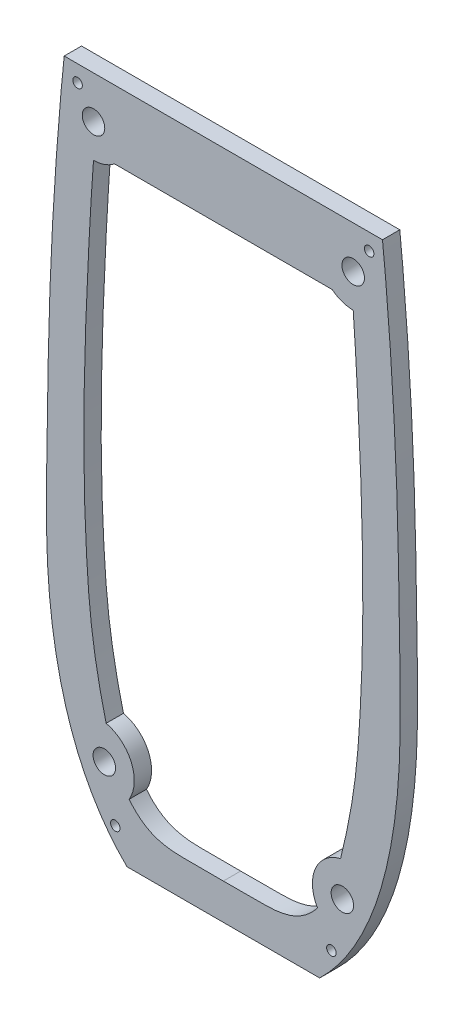
ISO-10303-21;
HEADER;
FILE_DESCRIPTION(('STEP AP214'),'2;1');
FILE_NAME('part.step','',(''),(''),'','','');
FILE_SCHEMA(('AUTOMOTIVE_DESIGN { 1 0 10303 214 1 1 1 1 }'));
ENDSEC;
DATA;
#1=APPLICATION_CONTEXT('core data for automotive mechanical design processes');
#2=APPLICATION_PROTOCOL_DEFINITION('international standard','automotive_design',2000,#1);
#3=PRODUCT_CONTEXT('',#1,'mechanical');
#4=PRODUCT('Part','Part','',(#3));
#5=PRODUCT_RELATED_PRODUCT_CATEGORY('part','',(#4));
#6=PRODUCT_DEFINITION_FORMATION('','',#4);
#7=PRODUCT_DEFINITION_CONTEXT('part definition',#1,'design');
#8=PRODUCT_DEFINITION('design','',#6,#7);
#9=PRODUCT_DEFINITION_SHAPE('','',#8);
#10=(LENGTH_UNIT() NAMED_UNIT(*) SI_UNIT(.MILLI.,.METRE.));
#11=(NAMED_UNIT(*) PLANE_ANGLE_UNIT() SI_UNIT($,.RADIAN.));
#12=(NAMED_UNIT(*) SI_UNIT($,.STERADIAN.) SOLID_ANGLE_UNIT());
#13=UNCERTAINTY_MEASURE_WITH_UNIT(LENGTH_MEASURE(1.E-05),#10,'distance_accuracy_value','');
#14=(GEOMETRIC_REPRESENTATION_CONTEXT(3) GLOBAL_UNCERTAINTY_ASSIGNED_CONTEXT((#13)) GLOBAL_UNIT_ASSIGNED_CONTEXT((#10,
#11,#12)) REPRESENTATION_CONTEXT('',''));
#15=CARTESIAN_POINT('',(0.,0.,0.));
#16=DIRECTION('',(0.,0.,1.));
#17=DIRECTION('',(1.,0.,0.));
#18=AXIS2_PLACEMENT_3D('',#15,#16,#17);
#19=CARTESIAN_POINT('',(-32.179766890658,79.8808838842301,4.));
#20=DIRECTION('',(0.,0.,1.));
#21=DIRECTION('',(1.,0.,0.));
#22=AXIS2_PLACEMENT_3D('',#19,#20,#21);
#23=PLANE('',#22);
#24=CARTESIAN_POINT('',(36.7676088978895,160.670428059175,4.));
#25=CARTESIAN_POINT('',(37.0466405345219,158.607809885298,4.));
#26=CARTESIAN_POINT('',(40.0719932945359,127.385925042913,4.));
#27=CARTESIAN_POINT('',(40.8031802336608,77.5360534846798,4.));
#28=CARTESIAN_POINT('',(41.343202954197,45.3581316902445,4.));
#29=CARTESIAN_POINT('',(33.8941715565068,17.0373017906577,4.));
#30=CARTESIAN_POINT('',(22.2593881149463,5.69205991105824,4.));
#31=B_SPLINE_CURVE_WITH_KNOTS('',3,(#24,#25,#26,#27,#28,#29,#30),.UNSPECIFIED.,.F.,.F.,(4,1,1,1,
4),(0.,0.322711203640363,0.500184687163331,0.698743588252615,1.),.UNSPECIFIED.);
#32=CARTESIAN_POINT('',(36.7676088978895,160.670428059175,4.));
#33=VERTEX_POINT('',#32);
#34=CARTESIAN_POINT('',(22.2593881149463,5.69205991105824,4.));
#35=VERTEX_POINT('',#34);
#36=EDGE_CURVE('E206',#33,#35,#31,.T.);
#37=ORIENTED_EDGE('',*,*,#36,.F.);
#38=DIRECTION('',(-1.,0.,0.));
#39=VECTOR('',#38,1.);
#40=CARTESIAN_POINT('',(-36.7676088978895,160.670428059175,4.));
#41=LINE('',#40,#39);
#42=CARTESIAN_POINT('',(-36.7676088978895,160.670428059175,4.));
#43=VERTEX_POINT('',#42);
#44=EDGE_CURVE('E113',#33,#43,#41,.T.);
#45=ORIENTED_EDGE('',*,*,#44,.T.);
#46=CARTESIAN_POINT('',(-36.7676088978895,160.670428059175,4.));
#47=CARTESIAN_POINT('',(-37.0466405345219,158.607809885298,4.));
#48=CARTESIAN_POINT('',(-40.0719932945359,127.385925042913,4.));
#49=CARTESIAN_POINT('',(-40.8031802336608,77.5360534846798,4.));
#50=CARTESIAN_POINT('',(-41.343202954197,45.3581316902445,4.));
#51=CARTESIAN_POINT('',(-33.8941715565068,17.0373017906577,4.));
#52=CARTESIAN_POINT('',(-22.2593881149463,5.69205991105824,4.));
#53=B_SPLINE_CURVE_WITH_KNOTS('',3,(#46,#47,#48,#49,#50,#51,#52),.UNSPECIFIED.,.F.,.F.,(4,1,1,1,
4),(0.,0.322711203640363,0.500184687163331,0.698743588252615,1.),.UNSPECIFIED.);
#54=CARTESIAN_POINT('',(-22.2593881149463,5.69205991105824,4.));
#55=VERTEX_POINT('',#54);
#56=EDGE_CURVE('E104',#43,#55,#53,.T.);
#57=ORIENTED_EDGE('',*,*,#56,.T.);
#58=DIRECTION('',(1.,0.,0.));
#59=VECTOR('',#58,1.);
#60=CARTESIAN_POINT('',(1.28369537222284E-13,5.69205991105824,4.));
#61=LINE('',#60,#59);
#62=EDGE_CURVE('E110',#55,#35,#61,.T.);
#63=ORIENTED_EDGE('',*,*,#62,.T.);
#64=EDGE_LOOP('',(#37,#45,#57,#63));
#65=FACE_BOUND('',#64,.T.);
#66=CARTESIAN_POINT('',(-30.,150.911100024357,4.));
#67=DIRECTION('',(0.,0.,1.));
#68=DIRECTION('',(1.,0.,0.));
#69=AXIS2_PLACEMENT_3D('',#66,#67,#68);
#70=CIRCLE('',#69,2.6);
#71=CARTESIAN_POINT('',(-27.4,150.911100024357,4.));
#72=VERTEX_POINT('',#71);
#73=EDGE_CURVE('E282',#72,#72,#70,.T.);
#74=ORIENTED_EDGE('',*,*,#73,.F.);
#75=EDGE_LOOP('',(#74));
#76=FACE_BOUND('',#75,.T.);
#77=CARTESIAN_POINT('',(-33.6878664174663,156.849138163036,4.));
#78=DIRECTION('',(0.,0.,1.));
#79=DIRECTION('',(-1.,0.,0.));
#80=AXIS2_PLACEMENT_3D('',#77,#78,#79);
#81=ELLIPSE('',#80,1.1,1.099329909721);
#82=CARTESIAN_POINT('',(-34.7878664174663,156.849138163036,4.));
#83=VERTEX_POINT('',#82);
#84=EDGE_CURVE('E294',#83,#83,#81,.T.);
#85=ORIENTED_EDGE('',*,*,#84,.F.);
#86=EDGE_LOOP('',(#85));
#87=FACE_BOUND('',#86,.T.);
#88=CARTESIAN_POINT('',(-27.080177886475,31.9833955839702,4.));
#89=CARTESIAN_POINT('',(-28.706578592029,38.3965843389482,4.));
#90=CARTESIAN_POINT('',(-30.5154901845642,47.8151657638262,4.));
#91=CARTESIAN_POINT('',(-32.4164245535466,73.4343698800869,4.));
#92=CARTESIAN_POINT('',(-32.5527470156279,100.120175103853,4.));
#93=CARTESIAN_POINT('',(-30.5393486145271,136.048346926643,4.));
#94=CARTESIAN_POINT('',(-30.0025736333168,143.194860669635,4.));
#95=B_SPLINE_CURVE_WITH_KNOTS('',3,(#88,#89,#90,#91,#92,#93,#94),.UNSPECIFIED.,.F.,.F.,(4,1,1,1,
4),(0.399896913094657,0.535865385128787,0.582419791324176,0.865440975048543,0.989182780038056),.UNSPECIFIED.);
#96=CARTESIAN_POINT('',(-27.080177886475,31.9833955839702,4.));
#97=VERTEX_POINT('',#96);
#98=CARTESIAN_POINT('',(-30.0025736333168,143.194860669635,4.));
#99=VERTEX_POINT('',#98);
#100=EDGE_CURVE('E173',#97,#99,#95,.T.);
#101=ORIENTED_EDGE('',*,*,#100,.T.);
#102=CARTESIAN_POINT('',(-30.,150.911100024357,4.));
#103=DIRECTION('',(0.,0.,1.));
#104=DIRECTION('',(-1.,0.,0.));
#105=AXIS2_PLACEMENT_3D('',#102,#103,#104);
#106=ELLIPSE('',#105,7.72094317336586,7.71623978339755);
#107=CARTESIAN_POINT('',(-25.1615780641152,144.897902642347,4.));
#108=VERTEX_POINT('',#107);
#109=EDGE_CURVE('E92',#99,#108,#106,.T.);
#110=ORIENTED_EDGE('',*,*,#109,.T.);
#111=DIRECTION('',(1.,0.,0.));
#112=VECTOR('',#111,1.);
#113=CARTESIAN_POINT('',(0.,144.897902642347,4.));
#114=LINE('',#113,#112);
#115=CARTESIAN_POINT('',(25.1615780641152,144.897902642347,4.));
#116=VERTEX_POINT('',#115);
#117=EDGE_CURVE('E172',#108,#116,#114,.T.);
#118=ORIENTED_EDGE('',*,*,#117,.T.);
#119=CARTESIAN_POINT('',(30.,150.911100024357,4.));
#120=DIRECTION('',(0.,0.,-1.));
#121=DIRECTION('',(1.,0.,0.));
#122=AXIS2_PLACEMENT_3D('',#119,#120,#121);
#123=ELLIPSE('',#122,7.72094317336586,7.71623978339755);
#124=CARTESIAN_POINT('',(30.0025736333168,143.194860669635,4.));
#125=VERTEX_POINT('',#124);
#126=EDGE_CURVE('E186',#125,#116,#123,.T.);
#127=ORIENTED_EDGE('',*,*,#126,.F.);
#128=CARTESIAN_POINT('',(27.080177886475,31.9833955839702,4.));
#129=CARTESIAN_POINT('',(28.706578592029,38.3965843389482,4.));
#130=CARTESIAN_POINT('',(30.5154901845642,47.8151657638262,4.));
#131=CARTESIAN_POINT('',(32.4164245535466,73.4343698800869,4.));
#132=CARTESIAN_POINT('',(32.5527470156279,100.120175103853,4.));
#133=CARTESIAN_POINT('',(30.5393486145271,136.048346926643,4.));
#134=CARTESIAN_POINT('',(30.0025736333168,143.194860669635,4.));
#135=B_SPLINE_CURVE_WITH_KNOTS('',3,(#128,#129,#130,#131,#132,#133,#134),.UNSPECIFIED.,.F.,.F.,
(4,1,1,1,4),(0.399896913094657,0.535865385128787,0.582419791324176,0.865440975048543,
0.989182780038056),.UNSPECIFIED.);
#136=CARTESIAN_POINT('',(27.080177886475,31.9833955839702,4.));
#137=VERTEX_POINT('',#136);
#138=EDGE_CURVE('E250',#137,#125,#135,.T.);
#139=ORIENTED_EDGE('',*,*,#138,.F.);
#140=CARTESIAN_POINT('',(29.0356648157466,23.7592269526859,4.));
#141=DIRECTION('',(0.,0.,-1.));
#142=DIRECTION('',(1.,0.,0.));
#143=AXIS2_PLACEMENT_3D('',#140,#141,#142);
#144=ELLIPSE('',#143,8.45833076739153,8.45317818082449);
#145=CARTESIAN_POINT('',(21.7581077398917,19.451339794351,4.));
#146=VERTEX_POINT('',#145);
#147=EDGE_CURVE('E243',#146,#137,#144,.T.);
#148=ORIENTED_EDGE('',*,*,#147,.F.);
#149=CARTESIAN_POINT('',(-1.28369537222284E-13,13.9608030371721,4.));
#150=CARTESIAN_POINT('',(10.8993393860255,13.9608030371721,4.));
#151=CARTESIAN_POINT('',(11.4872188918057,13.9593497511254,4.));
#152=CARTESIAN_POINT('',(16.2355591144141,14.8374748000579,4.));
#153=CARTESIAN_POINT('',(19.4228134702489,16.4556427413987,4.));
#154=CARTESIAN_POINT('',(21.7581077398917,19.451339794351,4.));
#155=B_SPLINE_CURVE_WITH_KNOTS('',3,(#149,#150,#151,#152,#153,#154),.UNSPECIFIED.,.F.,.F.,(4,1,
1,4),(0.,0.128416154842598,0.156586267234339,0.281701123917408),.UNSPECIFIED.);
#156=CARTESIAN_POINT('',(-1.28369537222284E-13,13.9608030371721,4.));
#157=VERTEX_POINT('',#156);
#158=EDGE_CURVE('E209',#157,#146,#155,.T.);
#159=ORIENTED_EDGE('',*,*,#158,.F.);
#160=CARTESIAN_POINT('',(1.28369537222284E-13,13.9608030371721,4.));
#161=CARTESIAN_POINT('',(-10.8993393860255,13.9608030371721,4.));
#162=CARTESIAN_POINT('',(-11.4872188918057,13.9593497511254,4.));
#163=CARTESIAN_POINT('',(-16.2355591144141,14.8374748000579,4.));
#164=CARTESIAN_POINT('',(-19.4228134702489,16.4556427413987,4.));
#165=CARTESIAN_POINT('',(-21.7581077398917,19.451339794351,4.));
#166=B_SPLINE_CURVE_WITH_KNOTS('',3,(#160,#161,#162,#163,#164,#165),.UNSPECIFIED.,.F.,.F.,(4,1,
1,4),(0.,0.128416154842598,0.156586267234339,0.281701123917408),.UNSPECIFIED.);
#167=CARTESIAN_POINT('',(-21.7581077398917,19.451339794351,4.));
#168=VERTEX_POINT('',#167);
#169=EDGE_CURVE('E133',#157,#168,#166,.T.);
#170=ORIENTED_EDGE('',*,*,#169,.T.);
#171=CARTESIAN_POINT('',(-29.0356648157466,23.7592269526859,4.));
#172=DIRECTION('',(0.,0.,1.));
#173=DIRECTION('',(-1.,0.,0.));
#174=AXIS2_PLACEMENT_3D('',#171,#172,#173);
#175=ELLIPSE('',#174,8.45833076739153,8.45317818082449);
#176=EDGE_CURVE('E51',#168,#97,#175,.T.);
#177=ORIENTED_EDGE('',*,*,#176,.T.);
#178=EDGE_LOOP('',(#101,#110,#118,#127,#139,#148,#159,#170,#177));
#179=FACE_BOUND('',#178,.T.);
#180=CARTESIAN_POINT('',(-27.5,24.0876689691573,4.));
#181=DIRECTION('',(0.,0.,1.));
#182=DIRECTION('',(1.,0.,0.));
#183=AXIS2_PLACEMENT_3D('',#180,#181,#182);
#184=CIRCLE('',#183,2.6);
#185=CARTESIAN_POINT('',(-24.9,24.0876689691573,4.));
#186=VERTEX_POINT('',#185);
#187=EDGE_CURVE('E288',#186,#186,#184,.T.);
#188=ORIENTED_EDGE('',*,*,#187,.F.);
#189=EDGE_LOOP('',(#188));
#190=FACE_BOUND('',#189,.T.);
#191=CARTESIAN_POINT('',(-24.9634067254476,12.5666299743901,4.));
#192=DIRECTION('',(0.,0.,1.));
#193=DIRECTION('',(-1.,0.,0.));
#194=AXIS2_PLACEMENT_3D('',#191,#192,#193);
#195=ELLIPSE('',#194,1.1,1.099329909721);
#196=CARTESIAN_POINT('',(-26.0634067254476,12.5666299743901,4.));
#197=VERTEX_POINT('',#196);
#198=EDGE_CURVE('E271',#197,#197,#195,.T.);
#199=ORIENTED_EDGE('',*,*,#198,.F.);
#200=EDGE_LOOP('',(#199));
#201=FACE_BOUND('',#200,.T.);
#202=CARTESIAN_POINT('',(24.9634067254476,12.5666299743901,4.));
#203=DIRECTION('',(0.,0.,-1.));
#204=DIRECTION('',(1.,0.,0.));
#205=AXIS2_PLACEMENT_3D('',#202,#203,#204);
#206=ELLIPSE('',#205,1.1,1.099329909721);
#207=CARTESIAN_POINT('',(26.0634067254476,12.5666299743901,4.));
#208=VERTEX_POINT('',#207);
#209=EDGE_CURVE('E357',#208,#208,#206,.T.);
#210=ORIENTED_EDGE('',*,*,#209,.T.);
#211=EDGE_LOOP('',(#210));
#212=FACE_BOUND('',#211,.T.);
#213=CARTESIAN_POINT('',(30.,150.911100024357,4.));
#214=DIRECTION('',(0.,0.,-1.));
#215=DIRECTION('',(-1.,0.,0.));
#216=AXIS2_PLACEMENT_3D('',#213,#214,#215);
#217=CIRCLE('',#216,2.6);
#218=CARTESIAN_POINT('',(27.4,150.911100024357,4.));
#219=VERTEX_POINT('',#218);
#220=EDGE_CURVE('E352',#219,#219,#217,.T.);
#221=ORIENTED_EDGE('',*,*,#220,.T.);
#222=EDGE_LOOP('',(#221));
#223=FACE_BOUND('',#222,.T.);
#224=CARTESIAN_POINT('',(27.5,24.0876689691573,4.));
#225=DIRECTION('',(0.,0.,-1.));
#226=DIRECTION('',(-1.,0.,0.));
#227=AXIS2_PLACEMENT_3D('',#224,#225,#226);
#228=CIRCLE('',#227,2.6);
#229=CARTESIAN_POINT('',(24.9,24.0876689691573,4.));
#230=VERTEX_POINT('',#229);
#231=EDGE_CURVE('E346',#230,#230,#228,.T.);
#232=ORIENTED_EDGE('',*,*,#231,.T.);
#233=EDGE_LOOP('',(#232));
#234=FACE_BOUND('',#233,.T.);
#235=CARTESIAN_POINT('',(33.6878664174663,156.849138163036,4.));
#236=DIRECTION('',(0.,0.,-1.));
#237=DIRECTION('',(1.,0.,0.));
#238=AXIS2_PLACEMENT_3D('',#235,#236,#237);
#239=ELLIPSE('',#238,1.1,1.099329909721);
#240=CARTESIAN_POINT('',(34.7878664174663,156.849138163036,4.));
#241=VERTEX_POINT('',#240);
#242=EDGE_CURVE('E345',#241,#241,#239,.T.);
#243=ORIENTED_EDGE('',*,*,#242,.T.);
#244=EDGE_LOOP('',(#243));
#245=FACE_BOUND('',#244,.T.);
#246=ADVANCED_FACE('F33',(#65,#76,#87,#179,#190,#201,#212,#223,#234,#245),#23,.T.);
#247=CARTESIAN_POINT('',(-32.179766890658,79.8808838842301,0.));
#248=DIRECTION('',(0.,0.,1.));
#249=DIRECTION('',(1.,0.,0.));
#250=AXIS2_PLACEMENT_3D('',#247,#248,#249);
#251=PLANE('',#250);
#252=DIRECTION('',(-1.,0.,0.));
#253=VECTOR('',#252,1.);
#254=CARTESIAN_POINT('',(-36.7676088978895,160.670428059175,0.));
#255=LINE('',#254,#253);
#256=CARTESIAN_POINT('',(36.7676088978895,160.670428059175,0.));
#257=VERTEX_POINT('',#256);
#258=CARTESIAN_POINT('',(-36.7676088978895,160.670428059175,0.));
#259=VERTEX_POINT('',#258);
#260=EDGE_CURVE('E316',#257,#259,#255,.T.);
#261=ORIENTED_EDGE('',*,*,#260,.F.);
#262=CARTESIAN_POINT('',(36.7676088978895,160.670428059175,0.));
#263=CARTESIAN_POINT('',(37.0466405345219,158.607809885298,0.));
#264=CARTESIAN_POINT('',(40.0719932945359,127.385925042913,0.));
#265=CARTESIAN_POINT('',(40.8031802336608,77.5360534846798,0.));
#266=CARTESIAN_POINT('',(41.343202954197,45.3581316902445,0.));
#267=CARTESIAN_POINT('',(33.8941715565068,17.0373017906577,0.));
#268=CARTESIAN_POINT('',(22.2593881149463,5.69205991105824,0.));
#269=B_SPLINE_CURVE_WITH_KNOTS('',3,(#262,#263,#264,#265,#266,#267,#268),.UNSPECIFIED.,.F.,.F.,
(4,1,1,1,4),(0.,0.322711203640363,0.500184687163331,0.698743588252615,1.),.UNSPECIFIED.);
#270=CARTESIAN_POINT('',(22.2593881149463,5.69205991105824,0.));
#271=VERTEX_POINT('',#270);
#272=EDGE_CURVE('E572',#257,#271,#269,.T.);
#273=ORIENTED_EDGE('',*,*,#272,.T.);
#274=DIRECTION('',(1.,0.,0.));
#275=VECTOR('',#274,1.);
#276=CARTESIAN_POINT('',(1.28369537222284E-13,5.69205991105824,0.));
#277=LINE('',#276,#275);
#278=CARTESIAN_POINT('',(-22.2593881149463,5.69205991105824,0.));
#279=VERTEX_POINT('',#278);
#280=EDGE_CURVE('E611',#279,#271,#277,.T.);
#281=ORIENTED_EDGE('',*,*,#280,.F.);
#282=CARTESIAN_POINT('',(-36.7676088978895,160.670428059175,0.));
#283=CARTESIAN_POINT('',(-37.0466405345219,158.607809885298,0.));
#284=CARTESIAN_POINT('',(-40.0719932945359,127.385925042913,0.));
#285=CARTESIAN_POINT('',(-40.8031802336608,77.5360534846798,0.));
#286=CARTESIAN_POINT('',(-41.343202954197,45.3581316902445,0.));
#287=CARTESIAN_POINT('',(-33.8941715565068,17.0373017906577,0.));
#288=CARTESIAN_POINT('',(-22.2593881149463,5.69205991105824,0.));
#289=B_SPLINE_CURVE_WITH_KNOTS('',3,(#282,#283,#284,#285,#286,#287,#288),.UNSPECIFIED.,.F.,.F.,
(4,1,1,1,4),(0.,0.322711203640363,0.500184687163331,0.698743588252615,1.),.UNSPECIFIED.);
#290=EDGE_CURVE('E122',#259,#279,#289,.T.);
#291=ORIENTED_EDGE('',*,*,#290,.F.);
#292=EDGE_LOOP('',(#261,#273,#281,#291));
#293=FACE_BOUND('',#292,.T.);
#294=CARTESIAN_POINT('',(-27.080177886475,31.9833955839702,0.));
#295=CARTESIAN_POINT('',(-28.706578592029,38.3965843389482,0.));
#296=CARTESIAN_POINT('',(-30.5154901845642,47.8151657638262,0.));
#297=CARTESIAN_POINT('',(-32.4164245535466,73.4343698800869,0.));
#298=CARTESIAN_POINT('',(-32.5527470156279,100.120175103853,0.));
#299=CARTESIAN_POINT('',(-30.5393486145271,136.048346926643,0.));
#300=CARTESIAN_POINT('',(-30.0025736333168,143.194860669635,0.));
#301=B_SPLINE_CURVE_WITH_KNOTS('',3,(#294,#295,#296,#297,#298,#299,#300),.UNSPECIFIED.,.F.,.F.,
(4,1,1,1,4),(0.399896913094657,0.535865385128787,0.582419791324176,0.865440975048543,
0.989182780038056),.UNSPECIFIED.);
#302=CARTESIAN_POINT('',(-27.080177886475,31.9833955839702,0.));
#303=VERTEX_POINT('',#302);
#304=CARTESIAN_POINT('',(-30.0025736333168,143.194860669635,0.));
#305=VERTEX_POINT('',#304);
#306=EDGE_CURVE('E297',#303,#305,#301,.T.);
#307=ORIENTED_EDGE('',*,*,#306,.F.);
#308=CARTESIAN_POINT('',(-29.0356648157466,23.7592269526859,0.));
#309=DIRECTION('',(0.,0.,1.));
#310=DIRECTION('',(-1.,0.,0.));
#311=AXIS2_PLACEMENT_3D('',#308,#309,#310);
#312=ELLIPSE('',#311,8.45833076739153,8.45317818082449);
#313=CARTESIAN_POINT('',(-21.7581077398917,19.451339794351,0.));
#314=VERTEX_POINT('',#313);
#315=EDGE_CURVE('E84',#314,#303,#312,.T.);
#316=ORIENTED_EDGE('',*,*,#315,.F.);
#317=CARTESIAN_POINT('',(1.28369537222284E-13,13.9608030371721,0.));
#318=CARTESIAN_POINT('',(-10.8993393860255,13.9608030371721,0.));
#319=CARTESIAN_POINT('',(-11.4872188918057,13.9593497511254,0.));
#320=CARTESIAN_POINT('',(-16.2355591144141,14.8374748000579,0.));
#321=CARTESIAN_POINT('',(-19.4228134702489,16.4556427413987,0.));
#322=CARTESIAN_POINT('',(-21.7581077398917,19.451339794351,0.));
#323=B_SPLINE_CURVE_WITH_KNOTS('',3,(#317,#318,#319,#320,#321,#322),.UNSPECIFIED.,.F.,.F.,(4,1,
1,4),(0.,0.128416154842598,0.156586267234339,0.281701123917408),.UNSPECIFIED.);
#324=CARTESIAN_POINT('',(1.28369537222284E-13,13.9608030371721,0.));
#325=VERTEX_POINT('',#324);
#326=EDGE_CURVE('E78',#325,#314,#323,.T.);
#327=ORIENTED_EDGE('',*,*,#326,.F.);
#328=CARTESIAN_POINT('',(-1.28369537222284E-13,13.9608030371721,0.));
#329=CARTESIAN_POINT('',(10.8993393860255,13.9608030371721,0.));
#330=CARTESIAN_POINT('',(11.4872188918057,13.9593497511254,0.));
#331=CARTESIAN_POINT('',(16.2355591144141,14.8374748000579,0.));
#332=CARTESIAN_POINT('',(19.4228134702489,16.4556427413987,0.));
#333=CARTESIAN_POINT('',(21.7581077398917,19.451339794351,0.));
#334=B_SPLINE_CURVE_WITH_KNOTS('',3,(#328,#329,#330,#331,#332,#333),.UNSPECIFIED.,.F.,.F.,(4,1,
1,4),(0.,0.128416154842598,0.156586267234339,0.281701123917408),.UNSPECIFIED.);
#335=CARTESIAN_POINT('',(21.7581077398917,19.451339794351,0.));
#336=VERTEX_POINT('',#335);
#337=EDGE_CURVE('E570',#325,#336,#334,.T.);
#338=ORIENTED_EDGE('',*,*,#337,.T.);
#339=CARTESIAN_POINT('',(29.0356648157466,23.7592269526859,0.));
#340=DIRECTION('',(0.,0.,-1.));
#341=DIRECTION('',(1.,0.,0.));
#342=AXIS2_PLACEMENT_3D('',#339,#340,#341);
#343=ELLIPSE('',#342,8.45833076739153,8.45317818082449);
#344=CARTESIAN_POINT('',(27.080177886475,31.9833955839702,0.));
#345=VERTEX_POINT('',#344);
#346=EDGE_CURVE('E558',#336,#345,#343,.T.);
#347=ORIENTED_EDGE('',*,*,#346,.T.);
#348=CARTESIAN_POINT('',(27.080177886475,31.9833955839702,0.));
#349=CARTESIAN_POINT('',(28.706578592029,38.3965843389482,0.));
#350=CARTESIAN_POINT('',(30.5154901845642,47.8151657638262,0.));
#351=CARTESIAN_POINT('',(32.4164245535466,73.4343698800869,0.));
#352=CARTESIAN_POINT('',(32.5527470156279,100.120175103853,0.));
#353=CARTESIAN_POINT('',(30.5393486145271,136.048346926643,0.));
#354=CARTESIAN_POINT('',(30.0025736333168,143.194860669635,0.));
#355=B_SPLINE_CURVE_WITH_KNOTS('',3,(#348,#349,#350,#351,#352,#353,#354),.UNSPECIFIED.,.F.,.F.,
(4,1,1,1,4),(0.399896913094657,0.535865385128787,0.582419791324176,0.865440975048543,
0.989182780038056),.UNSPECIFIED.);
#356=CARTESIAN_POINT('',(30.0025736333168,143.194860669635,0.));
#357=VERTEX_POINT('',#356);
#358=EDGE_CURVE('E217',#345,#357,#355,.T.);
#359=ORIENTED_EDGE('',*,*,#358,.T.);
#360=CARTESIAN_POINT('',(30.,150.911100024357,0.));
#361=DIRECTION('',(0.,0.,-1.));
#362=DIRECTION('',(1.,0.,0.));
#363=AXIS2_PLACEMENT_3D('',#360,#361,#362);
#364=ELLIPSE('',#363,7.72094317336586,7.71623978339755);
#365=CARTESIAN_POINT('',(25.1615780641152,144.897902642347,0.));
#366=VERTEX_POINT('',#365);
#367=EDGE_CURVE('E255',#357,#366,#364,.T.);
#368=ORIENTED_EDGE('',*,*,#367,.T.);
#369=DIRECTION('',(1.,0.,0.));
#370=VECTOR('',#369,1.);
#371=CARTESIAN_POINT('',(0.,144.897902642347,0.));
#372=LINE('',#371,#370);
#373=CARTESIAN_POINT('',(-25.1615780641152,144.897902642347,0.));
#374=VERTEX_POINT('',#373);
#375=EDGE_CURVE('E195',#374,#366,#372,.T.);
#376=ORIENTED_EDGE('',*,*,#375,.F.);
#377=CARTESIAN_POINT('',(-30.,150.911100024357,0.));
#378=DIRECTION('',(0.,0.,1.));
#379=DIRECTION('',(-1.,0.,0.));
#380=AXIS2_PLACEMENT_3D('',#377,#378,#379);
#381=ELLIPSE('',#380,7.72094317336586,7.71623978339755);
#382=EDGE_CURVE('E603',#305,#374,#381,.T.);
#383=ORIENTED_EDGE('',*,*,#382,.F.);
#384=EDGE_LOOP('',(#307,#316,#327,#338,#347,#359,#368,#376,#383));
#385=FACE_BOUND('',#384,.T.);
#386=CARTESIAN_POINT('',(-33.6878664174663,156.849138163036,0.));
#387=DIRECTION('',(0.,0.,1.));
#388=DIRECTION('',(-1.,0.,0.));
#389=AXIS2_PLACEMENT_3D('',#386,#387,#388);
#390=ELLIPSE('',#389,1.1,1.099329909721);
#391=CARTESIAN_POINT('',(-34.7878664174663,156.849138163036,0.));
#392=VERTEX_POINT('',#391);
#393=EDGE_CURVE('E291',#392,#392,#390,.T.);
#394=ORIENTED_EDGE('',*,*,#393,.T.);
#395=EDGE_LOOP('',(#394));
#396=FACE_BOUND('',#395,.T.);
#397=CARTESIAN_POINT('',(-27.5,24.0876689691573,0.));
#398=DIRECTION('',(0.,0.,1.));
#399=DIRECTION('',(1.,0.,0.));
#400=AXIS2_PLACEMENT_3D('',#397,#398,#399);
#401=CIRCLE('',#400,2.6);
#402=CARTESIAN_POINT('',(-24.9,24.0876689691573,0.));
#403=VERTEX_POINT('',#402);
#404=EDGE_CURVE('E285',#403,#403,#401,.T.);
#405=ORIENTED_EDGE('',*,*,#404,.T.);
#406=EDGE_LOOP('',(#405));
#407=FACE_BOUND('',#406,.T.);
#408=CARTESIAN_POINT('',(-30.,150.911100024357,0.));
#409=DIRECTION('',(0.,0.,1.));
#410=DIRECTION('',(1.,0.,0.));
#411=AXIS2_PLACEMENT_3D('',#408,#409,#410);
#412=CIRCLE('',#411,2.6);
#413=CARTESIAN_POINT('',(-27.4,150.911100024357,0.));
#414=VERTEX_POINT('',#413);
#415=EDGE_CURVE('E276',#414,#414,#412,.T.);
#416=ORIENTED_EDGE('',*,*,#415,.T.);
#417=EDGE_LOOP('',(#416));
#418=FACE_BOUND('',#417,.T.);
#419=CARTESIAN_POINT('',(-24.9634067254476,12.5666299743901,0.));
#420=DIRECTION('',(0.,0.,1.));
#421=DIRECTION('',(-1.,0.,0.));
#422=AXIS2_PLACEMENT_3D('',#419,#420,#421);
#423=ELLIPSE('',#422,1.1,1.099329909721);
#424=CARTESIAN_POINT('',(-26.0634067254476,12.5666299743901,0.));
#425=VERTEX_POINT('',#424);
#426=EDGE_CURVE('E277',#425,#425,#423,.T.);
#427=ORIENTED_EDGE('',*,*,#426,.T.);
#428=EDGE_LOOP('',(#427));
#429=FACE_BOUND('',#428,.T.);
#430=CARTESIAN_POINT('',(24.9634067254476,12.5666299743901,0.));
#431=DIRECTION('',(0.,0.,-1.));
#432=DIRECTION('',(1.,0.,0.));
#433=AXIS2_PLACEMENT_3D('',#430,#431,#432);
#434=ELLIPSE('',#433,1.1,1.099329909721);
#435=CARTESIAN_POINT('',(26.0634067254476,12.5666299743901,0.));
#436=VERTEX_POINT('',#435);
#437=EDGE_CURVE('E333',#436,#436,#434,.T.);
#438=ORIENTED_EDGE('',*,*,#437,.F.);
#439=EDGE_LOOP('',(#438));
#440=FACE_BOUND('',#439,.T.);
#441=CARTESIAN_POINT('',(30.,150.911100024357,0.));
#442=DIRECTION('',(0.,0.,-1.));
#443=DIRECTION('',(-1.,0.,0.));
#444=AXIS2_PLACEMENT_3D('',#441,#442,#443);
#445=CIRCLE('',#444,2.6);
#446=CARTESIAN_POINT('',(27.4,150.911100024357,0.));
#447=VERTEX_POINT('',#446);
#448=EDGE_CURVE('E337',#447,#447,#445,.T.);
#449=ORIENTED_EDGE('',*,*,#448,.F.);
#450=EDGE_LOOP('',(#449));
#451=FACE_BOUND('',#450,.T.);
#452=CARTESIAN_POINT('',(27.5,24.0876689691573,0.));
#453=DIRECTION('',(0.,0.,-1.));
#454=DIRECTION('',(-1.,0.,0.));
#455=AXIS2_PLACEMENT_3D('',#452,#453,#454);
#456=CIRCLE('',#455,2.6);
#457=CARTESIAN_POINT('',(24.9,24.0876689691573,0.));
#458=VERTEX_POINT('',#457);
#459=EDGE_CURVE('E341',#458,#458,#456,.T.);
#460=ORIENTED_EDGE('',*,*,#459,.F.);
#461=EDGE_LOOP('',(#460));
#462=FACE_BOUND('',#461,.T.);
#463=CARTESIAN_POINT('',(33.6878664174663,156.849138163036,0.));
#464=DIRECTION('',(0.,0.,-1.));
#465=DIRECTION('',(1.,0.,0.));
#466=AXIS2_PLACEMENT_3D('',#463,#464,#465);
#467=ELLIPSE('',#466,1.1,1.099329909721);
#468=CARTESIAN_POINT('',(34.7878664174663,156.849138163036,0.));
#469=VERTEX_POINT('',#468);
#470=EDGE_CURVE('E256',#469,#469,#467,.T.);
#471=ORIENTED_EDGE('',*,*,#470,.F.);
#472=EDGE_LOOP('',(#471));
#473=FACE_BOUND('',#472,.T.);
#474=ADVANCED_FACE('F305',(#293,#385,#396,#407,#418,#429,#440,#451,#462,#473),#251,.F.);
#475=DIRECTION('',(0.,0.,-1.));
#476=VECTOR('',#475,1.);
#477=SURFACE_OF_LINEAR_EXTRUSION('',#95,#476);
#478=ORIENTED_EDGE('',*,*,#306,.T.);
#479=DIRECTION('',(0.,0.,-1.));
#480=VECTOR('',#479,1.);
#481=CARTESIAN_POINT('',(-30.0025736333168,143.194860669635,4.));
#482=LINE('',#481,#480);
#483=EDGE_CURVE('E11',#99,#305,#482,.T.);
#484=ORIENTED_EDGE('',*,*,#483,.F.);
#485=ORIENTED_EDGE('',*,*,#100,.F.);
#486=DIRECTION('',(0.,0.,-1.));
#487=VECTOR('',#486,1.);
#488=CARTESIAN_POINT('',(-27.080177886475,31.9833955839702,4.));
#489=LINE('',#488,#487);
#490=EDGE_CURVE('E595',#97,#303,#489,.T.);
#491=ORIENTED_EDGE('',*,*,#490,.T.);
#492=EDGE_LOOP('',(#478,#484,#485,#491));
#493=FACE_BOUND('',#492,.T.);
#494=ADVANCED_FACE('F35',(#493),#477,.F.);
#495=DIRECTION('',(0.,0.,-1.));
#496=VECTOR('',#495,1.);
#497=SURFACE_OF_LINEAR_EXTRUSION('',#106,#496);
#498=ORIENTED_EDGE('',*,*,#382,.T.);
#499=DIRECTION('',(0.,0.,-1.));
#500=VECTOR('',#499,1.);
#501=CARTESIAN_POINT('',(-25.1615780641152,144.897902642347,4.));
#502=LINE('',#501,#500);
#503=EDGE_CURVE('E43',#108,#374,#502,.T.);
#504=ORIENTED_EDGE('',*,*,#503,.F.);
#505=ORIENTED_EDGE('',*,*,#109,.F.);
#506=ORIENTED_EDGE('',*,*,#483,.T.);
#507=EDGE_LOOP('',(#498,#504,#505,#506));
#508=FACE_BOUND('',#507,.T.);
#509=ADVANCED_FACE('F166',(#508),#497,.F.);
#510=CARTESIAN_POINT('',(0.,144.897902642347,4.));
#511=DIRECTION('',(0.,1.,0.));
#512=DIRECTION('',(-1.,0.,0.));
#513=AXIS2_PLACEMENT_3D('',#510,#511,#512);
#514=PLANE('',#513);
#515=ORIENTED_EDGE('',*,*,#375,.T.);
#516=DIRECTION('',(0.,0.,-1.));
#517=VECTOR('',#516,1.);
#518=CARTESIAN_POINT('',(25.1615780641152,144.897902642347,4.));
#519=LINE('',#518,#517);
#520=EDGE_CURVE('E192',#116,#366,#519,.T.);
#521=ORIENTED_EDGE('',*,*,#520,.F.);
#522=ORIENTED_EDGE('',*,*,#117,.F.);
#523=ORIENTED_EDGE('',*,*,#503,.T.);
#524=EDGE_LOOP('',(#515,#521,#522,#523));
#525=FACE_BOUND('',#524,.T.);
#526=ADVANCED_FACE('F163',(#525),#514,.F.);
#527=CARTESIAN_POINT('',(-36.7676088978895,160.670428059175,4.));
#528=DIRECTION('',(0.,-1.,0.));
#529=DIRECTION('',(0.,0.,-1.));
#530=AXIS2_PLACEMENT_3D('',#527,#528,#529);
#531=PLANE('',#530);
#532=ORIENTED_EDGE('',*,*,#260,.T.);
#533=DIRECTION('',(0.,0.,-1.));
#534=VECTOR('',#533,1.);
#535=CARTESIAN_POINT('',(-36.7676088978895,160.670428059175,4.));
#536=LINE('',#535,#534);
#537=EDGE_CURVE('E126',#43,#259,#536,.T.);
#538=ORIENTED_EDGE('',*,*,#537,.F.);
#539=ORIENTED_EDGE('',*,*,#44,.F.);
#540=DIRECTION('',(0.,0.,-1.));
#541=VECTOR('',#540,1.);
#542=CARTESIAN_POINT('',(36.7676088978895,160.670428059175,4.));
#543=LINE('',#542,#541);
#544=EDGE_CURVE('E199',#33,#257,#543,.T.);
#545=ORIENTED_EDGE('',*,*,#544,.T.);
#546=EDGE_LOOP('',(#532,#538,#539,#545));
#547=FACE_BOUND('',#546,.T.);
#548=ADVANCED_FACE('F160',(#547),#531,.F.);
#549=DIRECTION('',(0.,0.,-1.));
#550=VECTOR('',#549,1.);
#551=SURFACE_OF_LINEAR_EXTRUSION('',#53,#550);
#552=ORIENTED_EDGE('',*,*,#290,.T.);
#553=DIRECTION('',(0.,0.,-1.));
#554=VECTOR('',#553,1.);
#555=CARTESIAN_POINT('',(-22.2593881149463,5.69205991105824,4.));
#556=LINE('',#555,#554);
#557=EDGE_CURVE('E119',#55,#279,#556,.T.);
#558=ORIENTED_EDGE('',*,*,#557,.F.);
#559=ORIENTED_EDGE('',*,*,#56,.F.);
#560=ORIENTED_EDGE('',*,*,#537,.T.);
#561=EDGE_LOOP('',(#552,#558,#559,#560));
#562=FACE_BOUND('',#561,.T.);
#563=ADVANCED_FACE('F120',(#562),#551,.F.);
#564=CARTESIAN_POINT('',(1.28369537222284E-13,5.69205991105824,4.));
#565=DIRECTION('',(0.,1.,0.));
#566=DIRECTION('',(0.,0.,1.));
#567=AXIS2_PLACEMENT_3D('',#564,#565,#566);
#568=PLANE('',#567);
#569=ORIENTED_EDGE('',*,*,#280,.T.);
#570=DIRECTION('',(0.,0.,-1.));
#571=VECTOR('',#570,1.);
#572=CARTESIAN_POINT('',(22.2593881149463,5.69205991105824,4.));
#573=LINE('',#572,#571);
#574=EDGE_CURVE('E131',#35,#271,#573,.T.);
#575=ORIENTED_EDGE('',*,*,#574,.F.);
#576=ORIENTED_EDGE('',*,*,#62,.F.);
#577=ORIENTED_EDGE('',*,*,#557,.T.);
#578=EDGE_LOOP('',(#569,#575,#576,#577));
#579=FACE_BOUND('',#578,.T.);
#580=ADVANCED_FACE('F129',(#579),#568,.F.);
#581=DIRECTION('',(0.,0.,-1.));
#582=VECTOR('',#581,1.);
#583=SURFACE_OF_LINEAR_EXTRUSION('',#166,#582);
#584=ORIENTED_EDGE('',*,*,#326,.T.);
#585=DIRECTION('',(0.,0.,-1.));
#586=VECTOR('',#585,1.);
#587=CARTESIAN_POINT('',(-21.7581077398917,19.451339794351,4.));
#588=LINE('',#587,#586);
#589=EDGE_CURVE('E594',#168,#314,#588,.T.);
#590=ORIENTED_EDGE('',*,*,#589,.F.);
#591=ORIENTED_EDGE('',*,*,#169,.F.);
#592=DIRECTION('',(0.,0.,-1.));
#593=VECTOR('',#592,1.);
#594=CARTESIAN_POINT('',(1.28369537222284E-13,13.9608030371721,4.));
#595=LINE('',#594,#593);
#596=EDGE_CURVE('E127',#157,#325,#595,.T.);
#597=ORIENTED_EDGE('',*,*,#596,.T.);
#598=EDGE_LOOP('',(#584,#590,#591,#597));
#599=FACE_BOUND('',#598,.T.);
#600=ADVANCED_FACE('F150',(#599),#583,.F.);
#601=DIRECTION('',(0.,0.,-1.));
#602=VECTOR('',#601,1.);
#603=SURFACE_OF_LINEAR_EXTRUSION('',#175,#602);
#604=ORIENTED_EDGE('',*,*,#315,.T.);
#605=ORIENTED_EDGE('',*,*,#490,.F.);
#606=ORIENTED_EDGE('',*,*,#176,.F.);
#607=ORIENTED_EDGE('',*,*,#589,.T.);
#608=EDGE_LOOP('',(#604,#605,#606,#607));
#609=FACE_BOUND('',#608,.T.);
#610=ADVANCED_FACE('F154',(#609),#603,.F.);
#611=DIRECTION('',(0.,0.,-1.));
#612=VECTOR('',#611,1.);
#613=SURFACE_OF_LINEAR_EXTRUSION('',#81,#612);
#614=ORIENTED_EDGE('',*,*,#84,.T.);
#615=EDGE_LOOP('',(#614));
#616=FACE_BOUND('',#615,.T.);
#617=ORIENTED_EDGE('',*,*,#393,.F.);
#618=EDGE_LOOP('',(#617));
#619=FACE_BOUND('',#618,.T.);
#620=ADVANCED_FACE('F299',(#616,#619),#613,.T.);
#621=CARTESIAN_POINT('',(-27.5,24.0876689691573,4.));
#622=DIRECTION('',(0.,0.,-1.));
#623=DIRECTION('',(-1.,0.,0.));
#624=AXIS2_PLACEMENT_3D('',#621,#622,#623);
#625=CYLINDRICAL_SURFACE('',#624,2.6);
#626=ORIENTED_EDGE('',*,*,#187,.T.);
#627=EDGE_LOOP('',(#626));
#628=FACE_BOUND('',#627,.T.);
#629=ORIENTED_EDGE('',*,*,#404,.F.);
#630=EDGE_LOOP('',(#629));
#631=FACE_BOUND('',#630,.T.);
#632=ADVANCED_FACE('F302',(#628,#631),#625,.F.);
#633=CARTESIAN_POINT('',(-30.,150.911100024357,4.));
#634=DIRECTION('',(0.,0.,-1.));
#635=DIRECTION('',(-1.,0.,0.));
#636=AXIS2_PLACEMENT_3D('',#633,#634,#635);
#637=CYLINDRICAL_SURFACE('',#636,2.6);
#638=ORIENTED_EDGE('',*,*,#73,.T.);
#639=EDGE_LOOP('',(#638));
#640=FACE_BOUND('',#639,.T.);
#641=ORIENTED_EDGE('',*,*,#415,.F.);
#642=EDGE_LOOP('',(#641));
#643=FACE_BOUND('',#642,.T.);
#644=ADVANCED_FACE('F268',(#640,#643),#637,.F.);
#645=DIRECTION('',(0.,0.,-1.));
#646=VECTOR('',#645,1.);
#647=SURFACE_OF_LINEAR_EXTRUSION('',#195,#646);
#648=ORIENTED_EDGE('',*,*,#198,.T.);
#649=EDGE_LOOP('',(#648));
#650=FACE_BOUND('',#649,.T.);
#651=ORIENTED_EDGE('',*,*,#426,.F.);
#652=EDGE_LOOP('',(#651));
#653=FACE_BOUND('',#652,.T.);
#654=ADVANCED_FACE('F263',(#650,#653),#647,.T.);
#655=DIRECTION('',(0.,0.,-1.));
#656=VECTOR('',#655,1.);
#657=SURFACE_OF_LINEAR_EXTRUSION('',#135,#656);
#658=ORIENTED_EDGE('',*,*,#358,.F.);
#659=DIRECTION('',(0.,0.,-1.));
#660=VECTOR('',#659,1.);
#661=CARTESIAN_POINT('',(27.080177886475,31.9833955839702,4.));
#662=LINE('',#661,#660);
#663=EDGE_CURVE('E278',#137,#345,#662,.T.);
#664=ORIENTED_EDGE('',*,*,#663,.F.);
#665=ORIENTED_EDGE('',*,*,#138,.T.);
#666=DIRECTION('',(0.,0.,-1.));
#667=VECTOR('',#666,1.);
#668=CARTESIAN_POINT('',(30.0025736333168,143.194860669635,4.));
#669=LINE('',#668,#667);
#670=EDGE_CURVE('E200',#125,#357,#669,.T.);
#671=ORIENTED_EDGE('',*,*,#670,.T.);
#672=EDGE_LOOP('',(#658,#664,#665,#671));
#673=FACE_BOUND('',#672,.T.);
#674=ADVANCED_FACE('F260',(#673),#657,.T.);
#675=DIRECTION('',(0.,0.,-1.));
#676=VECTOR('',#675,1.);
#677=SURFACE_OF_LINEAR_EXTRUSION('',#144,#676);
#678=ORIENTED_EDGE('',*,*,#346,.F.);
#679=DIRECTION('',(0.,0.,-1.));
#680=VECTOR('',#679,1.);
#681=CARTESIAN_POINT('',(21.7581077398917,19.451339794351,4.));
#682=LINE('',#681,#680);
#683=EDGE_CURVE('E562',#146,#336,#682,.T.);
#684=ORIENTED_EDGE('',*,*,#683,.F.);
#685=ORIENTED_EDGE('',*,*,#147,.T.);
#686=ORIENTED_EDGE('',*,*,#663,.T.);
#687=EDGE_LOOP('',(#678,#684,#685,#686));
#688=FACE_BOUND('',#687,.T.);
#689=ADVANCED_FACE('F235',(#688),#677,.T.);
#690=DIRECTION('',(0.,0.,-1.));
#691=VECTOR('',#690,1.);
#692=SURFACE_OF_LINEAR_EXTRUSION('',#155,#691);
#693=ORIENTED_EDGE('',*,*,#337,.F.);
#694=ORIENTED_EDGE('',*,*,#596,.F.);
#695=ORIENTED_EDGE('',*,*,#158,.T.);
#696=ORIENTED_EDGE('',*,*,#683,.T.);
#697=EDGE_LOOP('',(#693,#694,#695,#696));
#698=FACE_BOUND('',#697,.T.);
#699=ADVANCED_FACE('F231',(#698),#692,.T.);
#700=DIRECTION('',(0.,0.,-1.));
#701=VECTOR('',#700,1.);
#702=SURFACE_OF_LINEAR_EXTRUSION('',#31,#701);
#703=ORIENTED_EDGE('',*,*,#272,.F.);
#704=ORIENTED_EDGE('',*,*,#544,.F.);
#705=ORIENTED_EDGE('',*,*,#36,.T.);
#706=ORIENTED_EDGE('',*,*,#574,.T.);
#707=EDGE_LOOP('',(#703,#704,#705,#706));
#708=FACE_BOUND('',#707,.T.);
#709=ADVANCED_FACE('F226',(#708),#702,.T.);
#710=DIRECTION('',(0.,0.,-1.));
#711=VECTOR('',#710,1.);
#712=SURFACE_OF_LINEAR_EXTRUSION('',#123,#711);
#713=ORIENTED_EDGE('',*,*,#367,.F.);
#714=ORIENTED_EDGE('',*,*,#670,.F.);
#715=ORIENTED_EDGE('',*,*,#126,.T.);
#716=ORIENTED_EDGE('',*,*,#520,.T.);
#717=EDGE_LOOP('',(#713,#714,#715,#716));
#718=FACE_BOUND('',#717,.T.);
#719=ADVANCED_FACE('F203',(#718),#712,.T.);
#720=DIRECTION('',(0.,0.,-1.));
#721=VECTOR('',#720,1.);
#722=SURFACE_OF_LINEAR_EXTRUSION('',#239,#721);
#723=ORIENTED_EDGE('',*,*,#242,.F.);
#724=EDGE_LOOP('',(#723));
#725=FACE_BOUND('',#724,.T.);
#726=ORIENTED_EDGE('',*,*,#470,.T.);
#727=EDGE_LOOP('',(#726));
#728=FACE_BOUND('',#727,.T.);
#729=ADVANCED_FACE('F225',(#725,#728),#722,.F.);
#730=CARTESIAN_POINT('',(27.5,24.0876689691573,4.));
#731=DIRECTION('',(0.,0.,-1.));
#732=DIRECTION('',(-1.,0.,0.));
#733=AXIS2_PLACEMENT_3D('',#730,#731,#732);
#734=CYLINDRICAL_SURFACE('',#733,2.6);
#735=ORIENTED_EDGE('',*,*,#231,.F.);
#736=EDGE_LOOP('',(#735));
#737=FACE_BOUND('',#736,.T.);
#738=ORIENTED_EDGE('',*,*,#459,.T.);
#739=EDGE_LOOP('',(#738));
#740=FACE_BOUND('',#739,.T.);
#741=ADVANCED_FACE('F370',(#737,#740),#734,.F.);
#742=CARTESIAN_POINT('',(30.,150.911100024357,4.));
#743=DIRECTION('',(0.,0.,-1.));
#744=DIRECTION('',(-1.,0.,0.));
#745=AXIS2_PLACEMENT_3D('',#742,#743,#744);
#746=CYLINDRICAL_SURFACE('',#745,2.6);
#747=ORIENTED_EDGE('',*,*,#220,.F.);
#748=EDGE_LOOP('',(#747));
#749=FACE_BOUND('',#748,.T.);
#750=ORIENTED_EDGE('',*,*,#448,.T.);
#751=EDGE_LOOP('',(#750));
#752=FACE_BOUND('',#751,.T.);
#753=ADVANCED_FACE('F367',(#749,#752),#746,.F.);
#754=DIRECTION('',(0.,0.,-1.));
#755=VECTOR('',#754,1.);
#756=SURFACE_OF_LINEAR_EXTRUSION('',#206,#755);
#757=ORIENTED_EDGE('',*,*,#209,.F.);
#758=EDGE_LOOP('',(#757));
#759=FACE_BOUND('',#758,.T.);
#760=ORIENTED_EDGE('',*,*,#437,.T.);
#761=EDGE_LOOP('',(#760));
#762=FACE_BOUND('',#761,.T.);
#763=ADVANCED_FACE('F364',(#759,#762),#756,.F.);
#764=CLOSED_SHELL('',(#246,#474,#494,#509,#526,#548,#563,#580,#600,#610,#620,#632,#644,#654,
#674,#689,#699,#709,#719,#729,#741,#753,#763));
#765=MANIFOLD_SOLID_BREP('B2',#764);
#766=ADVANCED_BREP_SHAPE_REPRESENTATION('',(#18,#765),#14);
#767=SHAPE_DEFINITION_REPRESENTATION(#9,#766);
ENDSEC;
END-ISO-10303-21;
